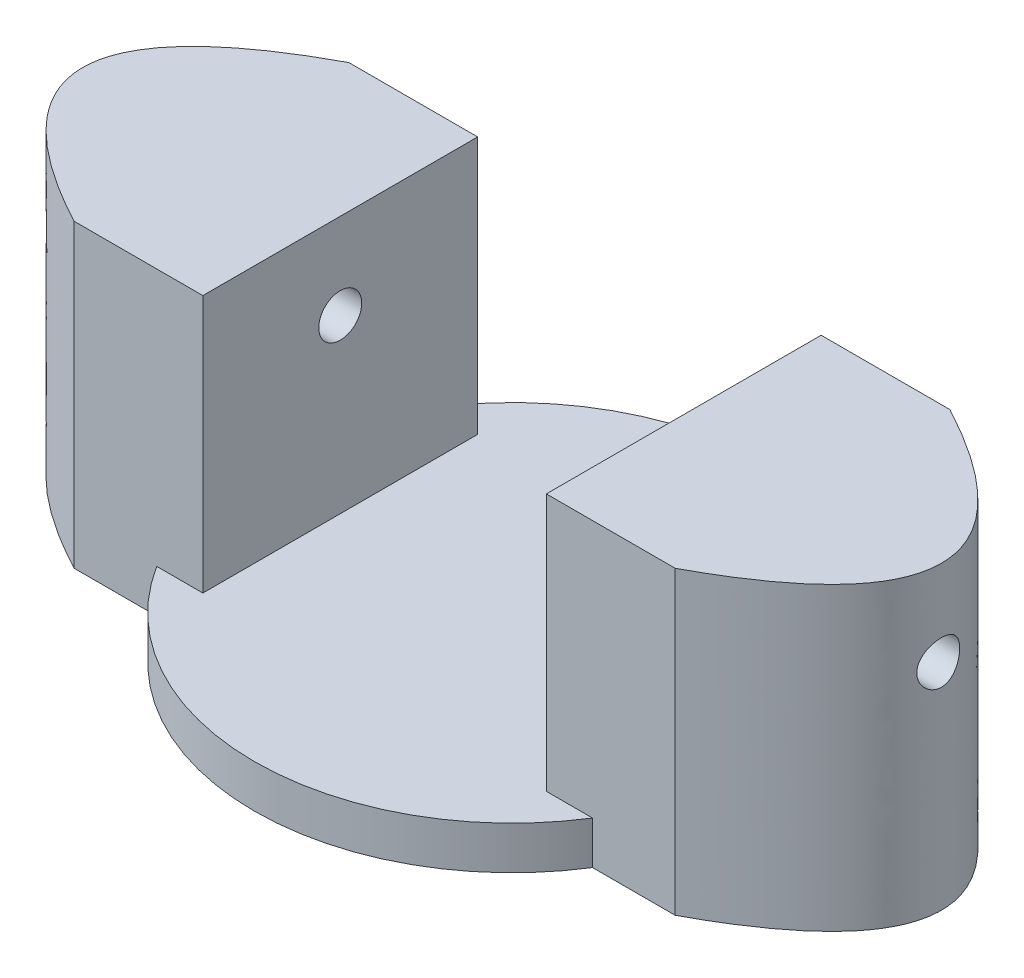
ISO-10303-21;
HEADER;
FILE_DESCRIPTION(('STEP AP214'),'2;1');
FILE_NAME('part.step','',(''),(''),'','','');
FILE_SCHEMA(('AUTOMOTIVE_DESIGN { 1 0 10303 214 1 1 1 1 }'));
ENDSEC;
DATA;
#1=APPLICATION_CONTEXT('core data for automotive mechanical design processes');
#2=APPLICATION_PROTOCOL_DEFINITION('international standard','automotive_design',2000,#1);
#3=PRODUCT_CONTEXT('',#1,'mechanical');
#4=PRODUCT('Part','Part','',(#3));
#5=PRODUCT_RELATED_PRODUCT_CATEGORY('part','',(#4));
#6=PRODUCT_DEFINITION_FORMATION('','',#4);
#7=PRODUCT_DEFINITION_CONTEXT('part definition',#1,'design');
#8=PRODUCT_DEFINITION('design','',#6,#7);
#9=PRODUCT_DEFINITION_SHAPE('','',#8);
#10=(LENGTH_UNIT() NAMED_UNIT(*) SI_UNIT(.MILLI.,.METRE.));
#11=(NAMED_UNIT(*) PLANE_ANGLE_UNIT() SI_UNIT($,.RADIAN.));
#12=(NAMED_UNIT(*) SI_UNIT($,.STERADIAN.) SOLID_ANGLE_UNIT());
#13=UNCERTAINTY_MEASURE_WITH_UNIT(LENGTH_MEASURE(1.E-05),#10,'distance_accuracy_value','');
#14=(GEOMETRIC_REPRESENTATION_CONTEXT(3) GLOBAL_UNCERTAINTY_ASSIGNED_CONTEXT((#13)) GLOBAL_UNIT_ASSIGNED_CONTEXT((#10,
#11,#12)) REPRESENTATION_CONTEXT('',''));
#15=CARTESIAN_POINT('',(0.,0.,0.));
#16=DIRECTION('',(0.,0.,1.));
#17=DIRECTION('',(1.,0.,0.));
#18=AXIS2_PLACEMENT_3D('',#15,#16,#17);
#19=CARTESIAN_POINT('',(0.,30.,-140.));
#20=DIRECTION('',(0.,0.,-1.));
#21=DIRECTION('',(-1.,0.,0.));
#22=AXIS2_PLACEMENT_3D('',#19,#20,#21);
#23=CYLINDRICAL_SURFACE('',#22,5.00000000000002);
#24=CARTESIAN_POINT('',(0.,30.,-140.));
#25=DIRECTION('',(0.,0.,-1.));
#26=DIRECTION('',(-1.,0.,0.));
#27=AXIS2_PLACEMENT_3D('',#24,#25,#26);
#28=CIRCLE('',#27,5.00000000000002);
#29=CARTESIAN_POINT('',(-5.00000000000005,30.,-140.));
#30=VERTEX_POINT('',#29);
#31=EDGE_CURVE('E12',#30,#30,#28,.T.);
#32=ORIENTED_EDGE('',*,*,#31,.T.);
#33=EDGE_LOOP('',(#32));
#34=FACE_BOUND('',#33,.T.);
#35=CARTESIAN_POINT('',(0.,30.,-160.));
#36=DIRECTION('',(0.,0.,-1.));
#37=DIRECTION('',(-1.,0.,0.));
#38=AXIS2_PLACEMENT_3D('',#35,#36,#37);
#39=CIRCLE('',#38,5.00000000000002);
#40=CARTESIAN_POINT('',(-5.00000000000005,30.,-160.));
#41=VERTEX_POINT('',#40);
#42=EDGE_CURVE('E77',#41,#41,#39,.T.);
#43=ORIENTED_EDGE('',*,*,#42,.F.);
#44=EDGE_LOOP('',(#43));
#45=FACE_BOUND('',#44,.T.);
#46=ADVANCED_FACE('F71',(#34,#45),#23,.T.);
#47=CARTESIAN_POINT('',(0.,30.,-140.));
#48=DIRECTION('',(0.,0.,-1.));
#49=DIRECTION('',(-1.,0.,0.));
#50=AXIS2_PLACEMENT_3D('',#47,#48,#49);
#51=PLANE('',#50);
#52=ORIENTED_EDGE('',*,*,#31,.F.);
#53=EDGE_LOOP('',(#52));
#54=FACE_BOUND('',#53,.T.);
#55=ADVANCED_FACE('F86',(#54),#51,.F.);
#56=CARTESIAN_POINT('',(0.,30.,-160.));
#57=DIRECTION('',(0.,0.,-1.));
#58=DIRECTION('',(-1.,0.,0.));
#59=AXIS2_PLACEMENT_3D('',#56,#57,#58);
#60=PLANE('',#59);
#61=ORIENTED_EDGE('',*,*,#42,.T.);
#62=EDGE_LOOP('',(#61));
#63=FACE_BOUND('',#62,.T.);
#64=ADVANCED_FACE('F83',(#63),#60,.T.);
#65=CLOSED_SHELL('',(#46,#55,#64));
#66=MANIFOLD_SOLID_BREP('B2',#65);
#67=CARTESIAN_POINT('',(0.,0.,0.));
#68=DIRECTION('',(0.,1.,0.));
#69=DIRECTION('',(0.,0.,1.));
#70=AXIS2_PLACEMENT_3D('',#67,#68,#69);
#71=PLANE('',#70);
#72=CARTESIAN_POINT('',(0.,0.,0.));
#73=DIRECTION('',(0.,1.,0.));
#74=DIRECTION('',(0.,0.,1.));
#75=AXIS2_PLACEMENT_3D('',#72,#73,#74);
#76=CIRCLE('',#75,25.);
#77=CARTESIAN_POINT('',(0.,0.,25.));
#78=VERTEX_POINT('',#77);
#79=EDGE_CURVE('E279',#78,#78,#76,.T.);
#80=ORIENTED_EDGE('',*,*,#79,.T.);
#81=EDGE_LOOP('',(#80));
#82=FACE_BOUND('',#81,.T.);
#83=CARTESIAN_POINT('',(-175.,0.,-80.));
#84=CARTESIAN_POINT('',(-325.,0.,0.));
#85=CARTESIAN_POINT('',(-175.,0.,80.));
#86=B_SPLINE_CURVE_WITH_KNOTS('',2,(#83,#84,#85),.UNSPECIFIED.,.F.,.F.,(3,3),(0.,1.),.UNSPECIFIED.);
#87=CARTESIAN_POINT('',(-175.,0.,-80.));
#88=VERTEX_POINT('',#87);
#89=CARTESIAN_POINT('',(-175.,0.,80.));
#90=VERTEX_POINT('',#89);
#91=EDGE_CURVE('E294',#88,#90,#86,.T.);
#92=ORIENTED_EDGE('',*,*,#91,.F.);
#93=DIRECTION('',(1.,0.,0.));
#94=VECTOR('',#93,1.);
#95=CARTESIAN_POINT('',(-250.,0.,-80.));
#96=LINE('',#95,#94);
#97=CARTESIAN_POINT('',(-126.885775404495,0.,-80.));
#98=VERTEX_POINT('',#97);
#99=EDGE_CURVE('E215',#88,#98,#96,.T.);
#100=ORIENTED_EDGE('',*,*,#99,.T.);
#101=CARTESIAN_POINT('',(0.,0.,0.));
#102=DIRECTION('',(0.,1.,0.));
#103=DIRECTION('',(0.,0.,1.));
#104=AXIS2_PLACEMENT_3D('',#101,#102,#103);
#105=CIRCLE('',#104,150.);
#106=CARTESIAN_POINT('',(126.885775404495,0.,-80.));
#107=VERTEX_POINT('',#106);
#108=EDGE_CURVE('E281',#107,#98,#105,.T.);
#109=ORIENTED_EDGE('',*,*,#108,.F.);
#110=DIRECTION('',(1.,0.,0.));
#111=VECTOR('',#110,1.);
#112=CARTESIAN_POINT('',(250.,0.,-80.));
#113=LINE('',#112,#111);
#114=CARTESIAN_POINT('',(175.,0.,-80.));
#115=VERTEX_POINT('',#114);
#116=EDGE_CURVE('E255',#107,#115,#113,.T.);
#117=ORIENTED_EDGE('',*,*,#116,.T.);
#118=CARTESIAN_POINT('',(175.,0.,-80.));
#119=CARTESIAN_POINT('',(325.,0.,0.));
#120=CARTESIAN_POINT('',(175.,0.,80.));
#121=B_SPLINE_CURVE_WITH_KNOTS('',2,(#118,#119,#120),.UNSPECIFIED.,.F.,.F.,(3,3),(0.,1.),.UNSPECIFIED.);
#122=CARTESIAN_POINT('',(175.,0.,80.));
#123=VERTEX_POINT('',#122);
#124=EDGE_CURVE('E331',#115,#123,#121,.T.);
#125=ORIENTED_EDGE('',*,*,#124,.T.);
#126=DIRECTION('',(-1.,0.,0.));
#127=VECTOR('',#126,1.);
#128=CARTESIAN_POINT('',(250.,0.,80.));
#129=LINE('',#128,#127);
#130=CARTESIAN_POINT('',(126.885775404495,0.,80.));
#131=VERTEX_POINT('',#130);
#132=EDGE_CURVE('E253',#123,#131,#129,.T.);
#133=ORIENTED_EDGE('',*,*,#132,.T.);
#134=CARTESIAN_POINT('',(-126.885775404495,0.,80.));
#135=VERTEX_POINT('',#134);
#136=EDGE_CURVE('E276',#135,#131,#105,.T.);
#137=ORIENTED_EDGE('',*,*,#136,.F.);
#138=DIRECTION('',(-1.,0.,0.));
#139=VECTOR('',#138,1.);
#140=CARTESIAN_POINT('',(-250.,0.,80.));
#141=LINE('',#140,#139);
#142=EDGE_CURVE('E230',#135,#90,#141,.T.);
#143=ORIENTED_EDGE('',*,*,#142,.T.);
#144=EDGE_LOOP('',(#92,#100,#109,#117,#125,#133,#137,#143));
#145=FACE_BOUND('',#144,.T.);
#146=ADVANCED_FACE('F112',(#82,#145),#71,.F.);
#147=CARTESIAN_POINT('',(0.,175.,0.));
#148=DIRECTION('',(0.,1.,0.));
#149=DIRECTION('',(0.,0.,1.));
#150=AXIS2_PLACEMENT_3D('',#147,#148,#149);
#151=PLANE('',#150);
#152=DIRECTION('',(-1.,0.,0.));
#153=VECTOR('',#152,1.);
#154=CARTESIAN_POINT('',(-250.,175.,-80.));
#155=LINE('',#154,#153);
#156=CARTESIAN_POINT('',(-99.9999999999999,175.,-80.));
#157=VERTEX_POINT('',#156);
#158=CARTESIAN_POINT('',(-175.,175.,-80.));
#159=VERTEX_POINT('',#158);
#160=EDGE_CURVE('E213',#157,#159,#155,.T.);
#161=ORIENTED_EDGE('',*,*,#160,.T.);
#162=CARTESIAN_POINT('',(-175.,175.,-80.));
#163=CARTESIAN_POINT('',(-325.,175.,0.));
#164=CARTESIAN_POINT('',(-175.,175.,80.));
#165=B_SPLINE_CURVE_WITH_KNOTS('',2,(#162,#163,#164),.UNSPECIFIED.,.F.,.F.,(3,3),(0.,1.),.UNSPECIFIED.);
#166=CARTESIAN_POINT('',(-175.,175.,80.));
#167=VERTEX_POINT('',#166);
#168=EDGE_CURVE('E199',#159,#167,#165,.T.);
#169=ORIENTED_EDGE('',*,*,#168,.T.);
#170=DIRECTION('',(1.,0.,0.));
#171=VECTOR('',#170,1.);
#172=CARTESIAN_POINT('',(-250.,175.,80.));
#173=LINE('',#172,#171);
#174=CARTESIAN_POINT('',(-100.,175.,80.));
#175=VERTEX_POINT('',#174);
#176=EDGE_CURVE('E225',#167,#175,#173,.T.);
#177=ORIENTED_EDGE('',*,*,#176,.T.);
#178=DIRECTION('',(0.,0.,-1.));
#179=VECTOR('',#178,1.);
#180=CARTESIAN_POINT('',(-100.,175.,80.));
#181=LINE('',#180,#179);
#182=EDGE_CURVE('E219',#175,#157,#181,.T.);
#183=ORIENTED_EDGE('',*,*,#182,.T.);
#184=EDGE_LOOP('',(#161,#169,#177,#183));
#185=FACE_BOUND('',#184,.T.);
#186=ADVANCED_FACE('F217',(#185),#151,.T.);
#187=CARTESIAN_POINT('',(-250.,125.,-2.10717200501364E-13));
#188=DIRECTION('',(1.,0.,0.));
#189=DIRECTION('',(0.,0.,-1.));
#190=AXIS2_PLACEMENT_3D('',#187,#188,#189);
#191=CYLINDRICAL_SURFACE('',#190,12.5);
#192=CARTESIAN_POINT('',(-100.,125.,0.));
#193=DIRECTION('',(1.,0.,0.));
#194=DIRECTION('',(0.,0.,-1.));
#195=AXIS2_PLACEMENT_3D('',#192,#193,#194);
#196=CIRCLE('',#195,12.5);
#197=CARTESIAN_POINT('',(-100.,125.,-12.5000000000001));
#198=VERTEX_POINT('',#197);
#199=EDGE_CURVE('E290',#198,#198,#196,.T.);
#200=ORIENTED_EDGE('',*,*,#199,.T.);
#201=EDGE_LOOP('',(#200));
#202=FACE_BOUND('',#201,.T.);
#203=CARTESIAN_POINT('',(-250.,137.5,6.59368393218784E-11));
#204=CARTESIAN_POINT('',(-249.999999346807,137.499999093875,0.343102084910564));
#205=CARTESIAN_POINT('',(-249.99585080345,137.485861748762,0.686223987417913));
#206=CARTESIAN_POINT('',(-249.979373640071,137.429427500027,1.37007406495184));
#207=CARTESIAN_POINT('',(-249.967041681019,137.387119101915,1.71080120548476));
#208=CARTESIAN_POINT('',(-249.934528830357,137.274619832521,2.38781234488959));
#209=CARTESIAN_POINT('',(-249.914335150058,137.204383526816,2.72408817646072));
#210=CARTESIAN_POINT('',(-249.866686475128,137.036649675183,3.38920138805786));
#211=CARTESIAN_POINT('',(-249.839232199246,136.939154827605,3.71803950087016));
#212=CARTESIAN_POINT('',(-249.777904896114,136.717938492816,4.365396408169));
#213=CARTESIAN_POINT('',(-249.744045003467,136.594270612394,4.68393478393176));
#214=CARTESIAN_POINT('',(-249.670810071922,136.321559422729,5.30929961748445));
#215=CARTESIAN_POINT('',(-249.631434906872,136.172515533032,5.61612580717173));
#216=CARTESIAN_POINT('',(-249.548258602354,135.850223297306,6.2159904206251));
#217=CARTESIAN_POINT('',(-249.504459292824,135.676984947462,6.5090344721173));
#218=CARTESIAN_POINT('',(-249.413573943264,135.307398268447,7.07977199005692));
#219=CARTESIAN_POINT('',(-249.366486734235,135.111041702483,7.3574599331701));
#220=CARTESIAN_POINT('',(-249.269076031287,134.691384194242,7.90242211914029));
#221=CARTESIAN_POINT('',(-249.21870110922,134.467533323812,8.16926382250951));
#222=CARTESIAN_POINT('',(-249.117189644228,133.998435968708,8.68327242838803));
#223=CARTESIAN_POINT('',(-249.066053089823,133.753189161283,8.93043903399651));
#224=CARTESIAN_POINT('',(-248.964392814078,133.242774112269,9.40360668477044));
#225=CARTESIAN_POINT('',(-248.913869320556,132.977598713439,9.62960005958933));
#226=CARTESIAN_POINT('',(-248.81485277516,132.429171584493,10.0587576423846));
#227=CARTESIAN_POINT('',(-248.766359023023,132.145926175126,10.2619297651479));
#228=CARTESIAN_POINT('',(-248.671795075195,131.557297229458,10.6479175668651));
#229=CARTESIAN_POINT('',(-248.625791707153,131.25158683047,10.8302516500298));
#230=CARTESIAN_POINT('',(-248.53860860211,130.62518262836,11.1684380205336));
#231=CARTESIAN_POINT('',(-248.497428945701,130.304488575024,11.3242898654437));
#232=CARTESIAN_POINT('',(-248.421124155886,129.650396122786,11.6082257108812));
#233=CARTESIAN_POINT('',(-248.385998006781,129.316999866634,11.7363143706458));
#234=CARTESIAN_POINT('',(-248.322859179983,128.639860477579,11.9636513142108));
#235=CARTESIAN_POINT('',(-248.294846276832,128.296117673001,12.06290051211));
#236=CARTESIAN_POINT('',(-248.247427346862,127.60993407839,12.2294571261765));
#237=CARTESIAN_POINT('',(-248.227815833081,127.267693304177,12.2975303517024));
#238=CARTESIAN_POINT('',(-248.19674715385,126.578354420217,12.4048565147915));
#239=CARTESIAN_POINT('',(-248.185289859428,126.231256387383,12.4441099081835));
#240=CARTESIAN_POINT('',(-248.170877511679,125.534878188346,12.4934274334157));
#241=CARTESIAN_POINT('',(-248.167920951844,125.185598419788,12.5034967372903));
#242=CARTESIAN_POINT('',(-248.170595993749,124.487458100767,12.4943653305232));
#243=CARTESIAN_POINT('',(-248.176227441452,124.138597542896,12.4751651448692));
#244=CARTESIAN_POINT('',(-248.195601574975,123.454689812635,12.4087222099399));
#245=CARTESIAN_POINT('',(-248.209088203206,123.119548941904,12.3623644582618));
#246=CARTESIAN_POINT('',(-248.243581515575,122.454508747715,12.2427373433014));
#247=CARTESIAN_POINT('',(-248.264588019879,122.124609299106,12.1694686235857));
#248=CARTESIAN_POINT('',(-248.313535341379,121.472288302598,11.9966291101765));
#249=CARTESIAN_POINT('',(-248.341476535127,121.149867161808,11.8970568881916));
#250=CARTESIAN_POINT('',(-248.403525176571,120.514648921365,11.6724086948999));
#251=CARTESIAN_POINT('',(-248.437632741013,120.201852004055,11.547332240725));
#252=CARTESIAN_POINT('',(-248.511529927186,119.584246905871,11.2709989947924));
#253=CARTESIAN_POINT('',(-248.5513819746,119.27957694503,11.1194500879753));
#254=CARTESIAN_POINT('',(-248.635381223079,118.684050993487,10.7923218074596));
#255=CARTESIAN_POINT('',(-248.679528442697,118.393195062461,10.6167423299641));
#256=CARTESIAN_POINT('',(-248.770942673286,117.827095078748,10.2427781872558));
#257=CARTESIAN_POINT('',(-248.818209401153,117.551849613574,10.0443955902774));
#258=CARTESIAN_POINT('',(-248.914652229052,117.018469521872,9.62601234770884));
#259=CARTESIAN_POINT('',(-248.963829188655,116.760342743275,9.4060019001639));
#260=CARTESIAN_POINT('',(-249.064608208854,116.253778833654,8.93739165223845));
#261=CARTESIAN_POINT('',(-249.116233225323,116.006040348185,8.68804097389517));
#262=CARTESIAN_POINT('',(-249.218690823966,115.532458148997,8.16938950286317));
#263=CARTESIAN_POINT('',(-249.269523717224,115.306605648528,7.90009679371777));
#264=CARTESIAN_POINT('',(-249.369037904199,114.878050546846,7.34300492329623));
#265=CARTESIAN_POINT('',(-249.417717717412,114.67536372767,7.05519335190481));
#266=CARTESIAN_POINT('',(-249.511516195468,114.294754648081,6.46309348002535));
#267=CARTESIAN_POINT('',(-249.556634971771,114.116831612421,6.15880569575005));
#268=CARTESIAN_POINT('',(-249.642351703571,113.785799137283,5.53334036635334));
#269=CARTESIAN_POINT('',(-249.682912059568,113.632891914238,5.21205054454521));
#270=CARTESIAN_POINT('',(-249.757902093828,113.354815381504,4.55700184013363));
#271=CARTESIAN_POINT('',(-249.79233206912,113.229644727858,4.22324356259691));
#272=CARTESIAN_POINT('',(-249.853965258085,113.008311087153,3.54626456578631));
#273=CARTESIAN_POINT('',(-249.881181448294,112.912095970537,3.20306208031795));
#274=CARTESIAN_POINT('',(-249.927619626672,112.749278004715,2.50931774572043));
#275=CARTESIAN_POINT('',(-249.946845307887,112.682661474676,2.15877936594865));
#276=CARTESIAN_POINT('',(-249.974426270505,112.587523366829,1.50717629539123));
#277=CARTESIAN_POINT('',(-249.983997425697,112.554722898391,1.20678000112669));
#278=CARTESIAN_POINT('',(-249.996784590355,112.510960773713,0.604260931712692));
#279=CARTESIAN_POINT('',(-250.000000575206,112.499999202063,0.3021381498805));
#280=CARTESIAN_POINT('',(-249.999999346808,112.500000906122,-0.343102084778307));
#281=CARTESIAN_POINT('',(-249.995850803452,112.514138251231,-0.686223987285458));
#282=CARTESIAN_POINT('',(-249.979373640075,112.570572499959,-1.37007406481932));
#283=CARTESIAN_POINT('',(-249.967041681025,112.612880898066,-1.71080120535238));
#284=CARTESIAN_POINT('',(-249.934528830365,112.725380167454,-2.38781234475788));
#285=CARTESIAN_POINT('',(-249.914335150066,112.795616473155,-2.72408817632954));
#286=CARTESIAN_POINT('',(-249.866686475138,112.96335032478,-3.38920138792804));
#287=CARTESIAN_POINT('',(-249.839232199257,113.060845172355,-3.71803950074117));
#288=CARTESIAN_POINT('',(-249.777904896127,113.282061507136,-4.36539640804199));
#289=CARTESIAN_POINT('',(-249.74404500348,113.405729387555,-4.68393478380588));
#290=CARTESIAN_POINT('',(-249.670810071938,113.678440577213,-5.30929961736114));
#291=CARTESIAN_POINT('',(-249.631434906888,113.827484466907,-5.61612580704984));
#292=CARTESIAN_POINT('',(-249.548258602371,114.149776702626,-6.21599042050631));
#293=CARTESIAN_POINT('',(-249.504459292842,114.323015052466,-6.50903447200019));
#294=CARTESIAN_POINT('',(-249.413573943283,114.692601731475,-7.07977198994345));
#295=CARTESIAN_POINT('',(-249.366486734254,114.888958297435,-7.35745993305859));
#296=CARTESIAN_POINT('',(-249.269076031307,115.30861580567,-7.90242211903288));
#297=CARTESIAN_POINT('',(-249.21870110924,115.532466676097,-8.16926382240427));
#298=CARTESIAN_POINT('',(-249.117189644248,116.001564031194,-8.68327242828743));
#299=CARTESIAN_POINT('',(-249.066053089843,116.246810838617,-8.93043903389838));
#300=CARTESIAN_POINT('',(-248.964392814099,116.757225887624,-9.40360668467747));
#301=CARTESIAN_POINT('',(-248.913869320577,117.022401286451,-9.62960005949906));
#302=CARTESIAN_POINT('',(-248.81485277518,117.570828415392,-10.0587576423));
#303=CARTESIAN_POINT('',(-248.766359023042,117.854073824756,-10.2619297650663));
#304=CARTESIAN_POINT('',(-248.671795075213,118.44270277042,-10.64791756679));
#305=CARTESIAN_POINT('',(-248.625791707171,118.748413169405,-10.8302516499581));
#306=CARTESIAN_POINT('',(-248.538608602127,119.374817371512,-11.1684380204692));
#307=CARTESIAN_POINT('',(-248.497428945717,119.695511424845,-11.324289865383));
#308=CARTESIAN_POINT('',(-248.421124155901,120.34960387708,-11.608225710828));
#309=CARTESIAN_POINT('',(-248.385998006794,120.68300013323,-11.7363143705964));
#310=CARTESIAN_POINT('',(-248.322859179995,121.360139522283,-11.9636513141692));
#311=CARTESIAN_POINT('',(-248.294846276843,121.70388232686,-12.0629005120724));
#312=CARTESIAN_POINT('',(-248.24742734687,122.390065921469,-12.2294571261468));
#313=CARTESIAN_POINT('',(-248.227815833088,122.732306695682,-12.2975303516768));
#314=CARTESIAN_POINT('',(-248.196747153855,123.421645579642,-12.4048565147739));
#315=CARTESIAN_POINT('',(-248.185289859432,123.768743612475,-12.4441099081699));
#316=CARTESIAN_POINT('',(-248.170877511681,124.465121811513,-12.49342743341));
#317=CARTESIAN_POINT('',(-248.167920951844,124.814401580071,-12.5034967372886));
#318=CARTESIAN_POINT('',(-248.170595993747,125.512541899094,-12.4943653305293));
#319=CARTESIAN_POINT('',(-248.176227441449,125.861402456965,-12.4751651448793));
#320=CARTESIAN_POINT('',(-248.19560157497,126.545310187227,-12.4087222099575));
#321=CARTESIAN_POINT('',(-248.209088203199,126.880451057959,-12.362364458283));
#322=CARTESIAN_POINT('',(-248.243581515567,127.54549125215,-12.24273734333));
#323=CARTESIAN_POINT('',(-248.264588019869,127.87539070076,-12.1694686236179));
#324=CARTESIAN_POINT('',(-248.313535341368,128.52771169727,-11.9966291102157));
#325=CARTESIAN_POINT('',(-248.341476535115,128.850132838061,-11.8970568882343));
#326=CARTESIAN_POINT('',(-248.403525176557,129.485351078507,-11.6724086949494));
#327=CARTESIAN_POINT('',(-248.437632740998,129.798147995819,-11.5473322407779));
#328=CARTESIAN_POINT('',(-248.51152992717,130.415753094005,-11.2709989948521));
#329=CARTESIAN_POINT('',(-248.551381974583,130.720423054849,-11.1194500880384));
#330=CARTESIAN_POINT('',(-248.635381223061,131.315949006395,-10.7923218075295));
#331=CARTESIAN_POINT('',(-248.679528442678,131.606804937422,-10.6167423300373));
#332=CARTESIAN_POINT('',(-248.770942673266,132.172904921138,-10.2427781873357));
#333=CARTESIAN_POINT('',(-248.818209401134,132.448150386314,-10.0443955903605));
#334=CARTESIAN_POINT('',(-248.914652229032,132.981530478021,-9.62601234779831));
#335=CARTESIAN_POINT('',(-248.963829188634,133.23965725662,-9.40600190025648));
#336=CARTESIAN_POINT('',(-249.064608208833,133.746221166245,-8.93739165233719));
#337=CARTESIAN_POINT('',(-249.116233225302,133.993959651717,-8.68804097399695));
#338=CARTESIAN_POINT('',(-249.218690823945,134.467541850911,-8.16938950297082));
#339=CARTESIAN_POINT('',(-249.269523717203,134.693394351383,-7.90009679382827));
#340=CARTESIAN_POINT('',(-249.369037904179,135.12194945307,-7.34300492341224));
#341=CARTESIAN_POINT('',(-249.417717717393,135.324636272249,-7.05519335202348));
#342=CARTESIAN_POINT('',(-249.511516195449,135.705245351845,-6.4630934801491));
#343=CARTESIAN_POINT('',(-249.556634971752,135.883168387508,-6.15880569587621));
#344=CARTESIAN_POINT('',(-249.642351703554,136.214200862653,-5.53334036648363));
#345=CARTESIAN_POINT('',(-249.682912059552,136.367108085702,-5.21205054467719));
#346=CARTESIAN_POINT('',(-249.757902093814,136.645184618444,-4.55700184026863));
#347=CARTESIAN_POINT('',(-249.792332069106,136.770355272093,-4.22324356273327));
#348=CARTESIAN_POINT('',(-249.853965258074,136.991688912806,-3.54626456592494));
#349=CARTESIAN_POINT('',(-249.881181448283,137.087904029426,-3.20306208045752));
#350=CARTESIAN_POINT('',(-249.927619626663,137.250721995257,-2.50931774586151));
#351=CARTESIAN_POINT('',(-249.94684530788,137.3173385253,-2.15877936609029));
#352=CARTESIAN_POINT('',(-249.974426270502,137.41247663316,-1.50717629548837));
#353=CARTESIAN_POINT('',(-249.983997425696,137.445277101605,-1.20678000117832));
#354=CARTESIAN_POINT('',(-249.996784590356,137.48903922629,-0.604260931672769));
#355=CARTESIAN_POINT('',(-250.000000575206,137.50000079794,-0.302138149794533));
#356=CARTESIAN_POINT('',(-250.,137.5,6.59368393218784E-11));
#357=B_SPLINE_CURVE_WITH_KNOTS('',3,(#203,#204,#205,#206,#207,#208,#209,#210,#211,#212,#213,
#214,#215,#216,#217,#218,#219,#220,#221,#222,#223,#224,#225,#226,#227,#228,#229,#230,#231,#232,
#233,#234,#235,#236,#237,#238,#239,#240,#241,#242,#243,#244,#245,#246,#247,#248,#249,#250,#251,
#252,#253,#254,#255,#256,#257,#258,#259,#260,#261,#262,#263,#264,#265,#266,#267,#268,#269,#270,
#271,#272,#273,#274,#275,#276,#277,#278,#279,#280,#281,#282,#283,#284,#285,#286,#287,#288,#289,
#290,#291,#292,#293,#294,#295,#296,#297,#298,#299,#300,#301,#302,#303,#304,#305,#306,#307,#308,
#309,#310,#311,#312,#313,#314,#315,#316,#317,#318,#319,#320,#321,#322,#323,#324,#325,#326,#327,
#328,#329,#330,#331,#332,#333,#334,#335,#336,#337,#338,#339,#340,#341,#342,#343,#344,#345,#346,
#347,#348,#349,#350,#351,#352,#353,#354,#355,#356),.UNSPECIFIED.,.T.,.F.,(4,2,2,2,2,2,2,2,2,2,2,
2,2,2,2,2,2,2,2,2,2,2,2,2,2,2,2,2,2,2,2,2,2,2,2,2,2,2,2,2,2,2,2,2,2,2,2,2,2,2,2,2,2,2,2,2,2,2,2,
2,2,2,2,2,2,2,2,2,2,2,2,2,2,2,2,2,4),(0.,1.02902567045117,2.05847146639345,3.08959891004009,
4.12062431746768,5.14955810097172,6.17851542360448,7.20704887295515,8.235949893934,
9.29051589997581,10.3450978165962,11.4000603072561,12.4546557823898,13.530090894836,
14.6055439724205,15.6808164267374,16.7560547953829,17.80323995308,18.8504085476144,
19.8973915504976,20.9443557745509,21.9589634365151,22.9735468360669,23.9881853392562,
25.0028430542366,26.0295000617222,27.056161503861,28.0827299015608,29.1097657141263,
30.1743273394004,31.2384597799038,32.3033129121029,33.3681327008973,34.4411748897558,
35.5141650737061,36.585211802007,37.6557629629813,38.5619268181964,39.4680941832901,
40.4971198537402,41.5265656496814,42.5576930933272,43.5887185007539,44.617652284257,
45.6466096068888,46.6751430562385,47.7040440772164,48.7586100832569,49.8131919998759,
50.8681544905346,51.9227499656669,52.9981850781133,54.073638155698,55.148910610015,
56.2241489786607,57.2713341363593,58.3185027308951,59.3654857337798,60.4124499578345,
61.4270576197991,62.4416410193513,63.4562795225411,64.4709372375219,65.4975942450064,
66.524255687144,67.5508240848428,68.5778598974071,69.6424215226801,70.7065539631825,
71.7714070953805,72.8362268841738,73.909269073033,74.9822592569838,76.0533059852855,
77.1238571462606,78.0300210016134,78.9361883668447),.UNSPECIFIED.);
#358=CARTESIAN_POINT('',(-250.,137.5,6.59368393218784E-11));
#359=VERTEX_POINT('',#358);
#360=EDGE_CURVE('E120',#359,#359,#357,.T.);
#361=ORIENTED_EDGE('',*,*,#360,.F.);
#362=EDGE_LOOP('',(#361));
#363=FACE_BOUND('',#362,.T.);
#364=ADVANCED_FACE('F303',(#202,#363),#191,.F.);
#365=CARTESIAN_POINT('',(-250.,-219.317121994613,-80.));
#366=DIRECTION('',(0.,0.,-1.));
#367=DIRECTION('',(-1.,0.,0.));
#368=AXIS2_PLACEMENT_3D('',#365,#366,#367);
#369=PLANE('',#368);
#370=ORIENTED_EDGE('',*,*,#99,.F.);
#371=DIRECTION('',(0.,1.,0.));
#372=VECTOR('',#371,1.);
#373=CARTESIAN_POINT('',(-175.,-25.,-80.));
#374=LINE('',#373,#372);
#375=EDGE_CURVE('E69',#88,#159,#374,.T.);
#376=ORIENTED_EDGE('',*,*,#375,.T.);
#377=ORIENTED_EDGE('',*,*,#160,.F.);
#378=DIRECTION('',(0.,1.,0.));
#379=VECTOR('',#378,1.);
#380=CARTESIAN_POINT('',(-99.9999999999999,-219.317121994613,-80.));
#381=LINE('',#380,#379);
#382=CARTESIAN_POINT('',(-99.9999999999999,25.,-80.));
#383=VERTEX_POINT('',#382);
#384=EDGE_CURVE('E223',#383,#157,#381,.T.);
#385=ORIENTED_EDGE('',*,*,#384,.F.);
#386=DIRECTION('',(-1.,0.,0.));
#387=VECTOR('',#386,1.);
#388=CARTESIAN_POINT('',(0.,25.,-80.));
#389=LINE('',#388,#387);
#390=CARTESIAN_POINT('',(-126.885775404495,25.,-80.));
#391=VERTEX_POINT('',#390);
#392=EDGE_CURVE('E235',#383,#391,#389,.T.);
#393=ORIENTED_EDGE('',*,*,#392,.T.);
#394=DIRECTION('',(0.,-1.,0.));
#395=VECTOR('',#394,1.);
#396=CARTESIAN_POINT('',(-126.885775404495,25.,-80.));
#397=LINE('',#396,#395);
#398=EDGE_CURVE('E238',#98,#391,#397,.F.);
#399=ORIENTED_EDGE('',*,*,#398,.F.);
#400=EDGE_LOOP('',(#370,#376,#377,#385,#393,#399));
#401=FACE_BOUND('',#400,.T.);
#402=ADVANCED_FACE('F211',(#401),#369,.T.);
#403=CARTESIAN_POINT('',(-250.,-219.317121994613,80.));
#404=DIRECTION('',(0.,0.,1.));
#405=DIRECTION('',(1.,0.,0.));
#406=AXIS2_PLACEMENT_3D('',#403,#404,#405);
#407=PLANE('',#406);
#408=ORIENTED_EDGE('',*,*,#176,.F.);
#409=DIRECTION('',(0.,1.,0.));
#410=VECTOR('',#409,1.);
#411=CARTESIAN_POINT('',(-175.,-25.,80.));
#412=LINE('',#411,#410);
#413=EDGE_CURVE('E203',#90,#167,#412,.T.);
#414=ORIENTED_EDGE('',*,*,#413,.F.);
#415=ORIENTED_EDGE('',*,*,#142,.F.);
#416=DIRECTION('',(0.,-1.,0.));
#417=VECTOR('',#416,1.);
#418=CARTESIAN_POINT('',(-126.885775404495,25.,80.));
#419=LINE('',#418,#417);
#420=CARTESIAN_POINT('',(-126.885775404495,25.,80.));
#421=VERTEX_POINT('',#420);
#422=EDGE_CURVE('E242',#421,#135,#419,.T.);
#423=ORIENTED_EDGE('',*,*,#422,.F.);
#424=DIRECTION('',(1.,0.,0.));
#425=VECTOR('',#424,1.);
#426=CARTESIAN_POINT('',(0.,25.,80.));
#427=LINE('',#426,#425);
#428=CARTESIAN_POINT('',(-100.,25.,80.));
#429=VERTEX_POINT('',#428);
#430=EDGE_CURVE('E131',#421,#429,#427,.T.);
#431=ORIENTED_EDGE('',*,*,#430,.T.);
#432=DIRECTION('',(0.,1.,0.));
#433=VECTOR('',#432,1.);
#434=CARTESIAN_POINT('',(-100.,-219.317121994613,80.));
#435=LINE('',#434,#433);
#436=EDGE_CURVE('E220',#429,#175,#435,.T.);
#437=ORIENTED_EDGE('',*,*,#436,.T.);
#438=EDGE_LOOP('',(#408,#414,#415,#423,#431,#437));
#439=FACE_BOUND('',#438,.T.);
#440=ADVANCED_FACE('F347',(#439),#407,.T.);
#441=CARTESIAN_POINT('',(0.,25.,0.));
#442=DIRECTION('',(0.,-1.,0.));
#443=DIRECTION('',(0.,0.,-1.));
#444=AXIS2_PLACEMENT_3D('',#441,#442,#443);
#445=CYLINDRICAL_SURFACE('',#444,150.);
#446=CARTESIAN_POINT('',(0.,25.,0.));
#447=DIRECTION('',(0.,1.,0.));
#448=DIRECTION('',(0.,0.,1.));
#449=AXIS2_PLACEMENT_3D('',#446,#447,#448);
#450=CIRCLE('',#449,150.);
#451=CARTESIAN_POINT('',(126.885775404495,25.,80.));
#452=VERTEX_POINT('',#451);
#453=EDGE_CURVE('E280',#421,#452,#450,.T.);
#454=ORIENTED_EDGE('',*,*,#453,.F.);
#455=ORIENTED_EDGE('',*,*,#422,.T.);
#456=ORIENTED_EDGE('',*,*,#136,.T.);
#457=DIRECTION('',(0.,-1.,0.));
#458=VECTOR('',#457,1.);
#459=CARTESIAN_POINT('',(126.885775404495,25.,80.));
#460=LINE('',#459,#458);
#461=EDGE_CURVE('E273',#131,#452,#460,.F.);
#462=ORIENTED_EDGE('',*,*,#461,.T.);
#463=EDGE_LOOP('',(#454,#455,#456,#462));
#464=FACE_BOUND('',#463,.T.);
#465=ADVANCED_FACE('F392',(#464),#445,.T.);
#466=CARTESIAN_POINT('',(0.,-25.,0.));
#467=DIRECTION('',(0.,1.,0.));
#468=DIRECTION('',(0.,0.,1.));
#469=AXIS2_PLACEMENT_3D('',#466,#467,#468);
#470=CYLINDRICAL_SURFACE('',#469,25.);
#471=CARTESIAN_POINT('',(0.,-25.,0.));
#472=DIRECTION('',(0.,1.,0.));
#473=DIRECTION('',(0.,0.,1.));
#474=AXIS2_PLACEMENT_3D('',#471,#472,#473);
#475=CIRCLE('',#474,25.);
#476=CARTESIAN_POINT('',(0.,-25.,25.));
#477=VERTEX_POINT('',#476);
#478=EDGE_CURVE('E284',#477,#477,#475,.T.);
#479=ORIENTED_EDGE('',*,*,#478,.T.);
#480=EDGE_LOOP('',(#479));
#481=FACE_BOUND('',#480,.T.);
#482=ORIENTED_EDGE('',*,*,#79,.F.);
#483=EDGE_LOOP('',(#482));
#484=FACE_BOUND('',#483,.T.);
#485=ADVANCED_FACE('F114',(#481,#484),#470,.T.);
#486=CARTESIAN_POINT('',(0.,-25.,0.));
#487=DIRECTION('',(0.,1.,0.));
#488=DIRECTION('',(0.,0.,1.));
#489=AXIS2_PLACEMENT_3D('',#486,#487,#488);
#490=PLANE('',#489);
#491=ORIENTED_EDGE('',*,*,#478,.F.);
#492=EDGE_LOOP('',(#491));
#493=FACE_BOUND('',#492,.T.);
#494=ADVANCED_FACE('F419',(#493),#490,.F.);
#495=ORIENTED_EDGE('',*,*,#108,.T.);
#496=ORIENTED_EDGE('',*,*,#398,.T.);
#497=CARTESIAN_POINT('',(126.885775404495,25.,-80.));
#498=VERTEX_POINT('',#497);
#499=EDGE_CURVE('E277',#498,#391,#450,.T.);
#500=ORIENTED_EDGE('',*,*,#499,.F.);
#501=DIRECTION('',(0.,-1.,0.));
#502=VECTOR('',#501,1.);
#503=CARTESIAN_POINT('',(126.885775404495,25.,-80.));
#504=LINE('',#503,#502);
#505=EDGE_CURVE('E265',#498,#107,#504,.T.);
#506=ORIENTED_EDGE('',*,*,#505,.T.);
#507=EDGE_LOOP('',(#495,#496,#500,#506));
#508=FACE_BOUND('',#507,.T.);
#509=ADVANCED_FACE('F355',(#508),#445,.T.);
#510=CARTESIAN_POINT('',(0.,25.,0.));
#511=DIRECTION('',(0.,1.,0.));
#512=DIRECTION('',(0.,0.,1.));
#513=AXIS2_PLACEMENT_3D('',#510,#511,#512);
#514=PLANE('',#513);
#515=ORIENTED_EDGE('',*,*,#499,.T.);
#516=ORIENTED_EDGE('',*,*,#392,.F.);
#517=DIRECTION('',(0.,0.,-1.));
#518=VECTOR('',#517,1.);
#519=CARTESIAN_POINT('',(-100.,25.,0.));
#520=LINE('',#519,#518);
#521=EDGE_CURVE('E127',#429,#383,#520,.T.);
#522=ORIENTED_EDGE('',*,*,#521,.F.);
#523=ORIENTED_EDGE('',*,*,#430,.F.);
#524=ORIENTED_EDGE('',*,*,#453,.T.);
#525=DIRECTION('',(1.,0.,0.));
#526=VECTOR('',#525,1.);
#527=CARTESIAN_POINT('',(0.,25.,80.));
#528=LINE('',#527,#526);
#529=CARTESIAN_POINT('',(100.,25.,80.));
#530=VERTEX_POINT('',#529);
#531=EDGE_CURVE('E270',#530,#452,#528,.T.);
#532=ORIENTED_EDGE('',*,*,#531,.F.);
#533=DIRECTION('',(0.,0.,1.));
#534=VECTOR('',#533,1.);
#535=CARTESIAN_POINT('',(100.,25.,0.));
#536=LINE('',#535,#534);
#537=CARTESIAN_POINT('',(100.,25.,-80.));
#538=VERTEX_POINT('',#537);
#539=EDGE_CURVE('E267',#538,#530,#536,.T.);
#540=ORIENTED_EDGE('',*,*,#539,.F.);
#541=DIRECTION('',(-1.,0.,0.));
#542=VECTOR('',#541,1.);
#543=CARTESIAN_POINT('',(0.,25.,-80.));
#544=LINE('',#543,#542);
#545=EDGE_CURVE('E262',#498,#538,#544,.T.);
#546=ORIENTED_EDGE('',*,*,#545,.F.);
#547=EDGE_LOOP('',(#515,#516,#522,#523,#524,#532,#540,#546));
#548=FACE_BOUND('',#547,.T.);
#549=ADVANCED_FACE('F351',(#548),#514,.T.);
#550=CARTESIAN_POINT('',(250.,-219.317121994613,80.));
#551=DIRECTION('',(0.,0.,1.));
#552=DIRECTION('',(1.,0.,0.));
#553=AXIS2_PLACEMENT_3D('',#550,#551,#552);
#554=PLANE('',#553);
#555=DIRECTION('',(0.,1.,0.));
#556=VECTOR('',#555,1.);
#557=CARTESIAN_POINT('',(175.,-25.,80.));
#558=LINE('',#557,#556);
#559=CARTESIAN_POINT('',(175.,175.,80.));
#560=VERTEX_POINT('',#559);
#561=EDGE_CURVE('E326',#123,#560,#558,.T.);
#562=ORIENTED_EDGE('',*,*,#561,.T.);
#563=DIRECTION('',(1.,0.,0.));
#564=VECTOR('',#563,1.);
#565=CARTESIAN_POINT('',(250.,175.,80.));
#566=LINE('',#565,#564);
#567=CARTESIAN_POINT('',(100.,175.,80.));
#568=VERTEX_POINT('',#567);
#569=EDGE_CURVE('E249',#568,#560,#566,.T.);
#570=ORIENTED_EDGE('',*,*,#569,.F.);
#571=DIRECTION('',(0.,1.,0.));
#572=VECTOR('',#571,1.);
#573=CARTESIAN_POINT('',(100.,-219.317121994613,80.));
#574=LINE('',#573,#572);
#575=EDGE_CURVE('E256',#530,#568,#574,.T.);
#576=ORIENTED_EDGE('',*,*,#575,.F.);
#577=ORIENTED_EDGE('',*,*,#531,.T.);
#578=ORIENTED_EDGE('',*,*,#461,.F.);
#579=ORIENTED_EDGE('',*,*,#132,.F.);
#580=EDGE_LOOP('',(#562,#570,#576,#577,#578,#579));
#581=FACE_BOUND('',#580,.T.);
#582=ADVANCED_FACE('F373',(#581),#554,.T.);
#583=CARTESIAN_POINT('',(250.,-219.317121994613,-80.));
#584=DIRECTION('',(0.,0.,-1.));
#585=DIRECTION('',(-1.,0.,0.));
#586=AXIS2_PLACEMENT_3D('',#583,#584,#585);
#587=PLANE('',#586);
#588=DIRECTION('',(0.,1.,0.));
#589=VECTOR('',#588,1.);
#590=CARTESIAN_POINT('',(175.,-25.,-80.));
#591=LINE('',#590,#589);
#592=CARTESIAN_POINT('',(175.,175.,-80.));
#593=VERTEX_POINT('',#592);
#594=EDGE_CURVE('E207',#115,#593,#591,.T.);
#595=ORIENTED_EDGE('',*,*,#594,.F.);
#596=ORIENTED_EDGE('',*,*,#116,.F.);
#597=ORIENTED_EDGE('',*,*,#505,.F.);
#598=ORIENTED_EDGE('',*,*,#545,.T.);
#599=DIRECTION('',(0.,1.,0.));
#600=VECTOR('',#599,1.);
#601=CARTESIAN_POINT('',(100.,-219.317121994613,-80.));
#602=LINE('',#601,#600);
#603=CARTESIAN_POINT('',(100.,175.,-80.));
#604=VERTEX_POINT('',#603);
#605=EDGE_CURVE('E252',#538,#604,#602,.T.);
#606=ORIENTED_EDGE('',*,*,#605,.T.);
#607=DIRECTION('',(-1.,0.,0.));
#608=VECTOR('',#607,1.);
#609=CARTESIAN_POINT('',(250.,175.,-80.));
#610=LINE('',#609,#608);
#611=EDGE_CURVE('E244',#593,#604,#610,.T.);
#612=ORIENTED_EDGE('',*,*,#611,.F.);
#613=EDGE_LOOP('',(#595,#596,#597,#598,#606,#612));
#614=FACE_BOUND('',#613,.T.);
#615=ADVANCED_FACE('F361',(#614),#587,.T.);
#616=CARTESIAN_POINT('',(100.,-219.317121994613,80.));
#617=DIRECTION('',(-1.,0.,0.));
#618=DIRECTION('',(0.,0.,1.));
#619=AXIS2_PLACEMENT_3D('',#616,#617,#618);
#620=PLANE('',#619);
#621=CARTESIAN_POINT('',(100.,125.,0.));
#622=DIRECTION('',(-1.,0.,0.));
#623=DIRECTION('',(0.,0.,1.));
#624=AXIS2_PLACEMENT_3D('',#621,#622,#623);
#625=CIRCLE('',#624,12.5);
#626=CARTESIAN_POINT('',(100.,125.,12.5000000000001));
#627=VERTEX_POINT('',#626);
#628=EDGE_CURVE('E293',#627,#627,#625,.T.);
#629=ORIENTED_EDGE('',*,*,#628,.F.);
#630=EDGE_LOOP('',(#629));
#631=FACE_BOUND('',#630,.T.);
#632=ORIENTED_EDGE('',*,*,#605,.F.);
#633=ORIENTED_EDGE('',*,*,#539,.T.);
#634=ORIENTED_EDGE('',*,*,#575,.T.);
#635=DIRECTION('',(0.,0.,1.));
#636=VECTOR('',#635,1.);
#637=CARTESIAN_POINT('',(100.,175.,80.));
#638=LINE('',#637,#636);
#639=EDGE_CURVE('E246',#604,#568,#638,.T.);
#640=ORIENTED_EDGE('',*,*,#639,.F.);
#641=EDGE_LOOP('',(#632,#633,#634,#640));
#642=FACE_BOUND('',#641,.T.);
#643=ADVANCED_FACE('F395',(#631,#642),#620,.T.);
#644=CARTESIAN_POINT('',(0.,175.,0.));
#645=DIRECTION('',(0.,1.,0.));
#646=DIRECTION('',(0.,0.,1.));
#647=AXIS2_PLACEMENT_3D('',#644,#645,#646);
#648=PLANE('',#647);
#649=ORIENTED_EDGE('',*,*,#569,.T.);
#650=CARTESIAN_POINT('',(175.,175.,-80.));
#651=CARTESIAN_POINT('',(325.,175.,0.));
#652=CARTESIAN_POINT('',(175.,175.,80.));
#653=B_SPLINE_CURVE_WITH_KNOTS('',2,(#650,#651,#652),.UNSPECIFIED.,.F.,.F.,(3,3),(0.,1.),.UNSPECIFIED.);
#654=EDGE_CURVE('E319',#593,#560,#653,.T.);
#655=ORIENTED_EDGE('',*,*,#654,.F.);
#656=ORIENTED_EDGE('',*,*,#611,.T.);
#657=ORIENTED_EDGE('',*,*,#639,.T.);
#658=EDGE_LOOP('',(#649,#655,#656,#657));
#659=FACE_BOUND('',#658,.T.);
#660=ADVANCED_FACE('F368',(#659),#648,.T.);
#661=CARTESIAN_POINT('',(-100.,-219.317121994613,80.));
#662=DIRECTION('',(1.,0.,0.));
#663=DIRECTION('',(0.,0.,-1.));
#664=AXIS2_PLACEMENT_3D('',#661,#662,#663);
#665=PLANE('',#664);
#666=ORIENTED_EDGE('',*,*,#199,.F.);
#667=EDGE_LOOP('',(#666));
#668=FACE_BOUND('',#667,.T.);
#669=ORIENTED_EDGE('',*,*,#436,.F.);
#670=ORIENTED_EDGE('',*,*,#521,.T.);
#671=ORIENTED_EDGE('',*,*,#384,.T.);
#672=ORIENTED_EDGE('',*,*,#182,.F.);
#673=EDGE_LOOP('',(#669,#670,#671,#672));
#674=FACE_BOUND('',#673,.T.);
#675=ADVANCED_FACE('F350',(#668,#674),#665,.T.);
#676=ORIENTED_EDGE('',*,*,#628,.T.);
#677=EDGE_LOOP('',(#676));
#678=FACE_BOUND('',#677,.T.);
#679=CARTESIAN_POINT('',(250.,112.5,1.08593689596148E-12));
#680=CARTESIAN_POINT('',(249.999999346807,112.500000906123,-0.34310208484335));
#681=CARTESIAN_POINT('',(249.995850803451,112.514138251234,-0.686223987350602));
#682=CARTESIAN_POINT('',(249.979373640073,112.570572499966,-1.3700740648845));
#683=CARTESIAN_POINT('',(249.967041681022,112.612880898075,-1.71080120541749));
#684=CARTESIAN_POINT('',(249.934528830361,112.725380167466,-2.38781234482266));
#685=CARTESIAN_POINT('',(249.914335150062,112.795616473169,-2.72408817639406));
#686=CARTESIAN_POINT('',(249.866686475133,112.963350324798,-3.38920138799189));
#687=CARTESIAN_POINT('',(249.839232199252,113.060845172374,-3.71803950080461));
#688=CARTESIAN_POINT('',(249.777904896121,113.28206150716,-4.36539640810445));
#689=CARTESIAN_POINT('',(249.744045003474,113.40572938758,-4.68393478386779));
#690=CARTESIAN_POINT('',(249.67081007193,113.678440577242,-5.30929961742178));
#691=CARTESIAN_POINT('',(249.63143490688,113.827484466937,-5.61612580710977));
#692=CARTESIAN_POINT('',(249.548258602363,114.149776702659,-6.21599042056472));
#693=CARTESIAN_POINT('',(249.504459292833,114.323015052502,-6.50903447205776));
#694=CARTESIAN_POINT('',(249.413573943274,114.692601731514,-7.07977198999922));
#695=CARTESIAN_POINT('',(249.366486734244,114.888958297475,-7.35745993311339));
#696=CARTESIAN_POINT('',(249.269076031297,115.308615805714,-7.90242211908566));
#697=CARTESIAN_POINT('',(249.21870110923,115.532466676142,-8.16926382245598));
#698=CARTESIAN_POINT('',(249.117189644238,116.001564031242,-8.68327242833685));
#699=CARTESIAN_POINT('',(249.066053089833,116.246810838666,-8.93043903394658));
#700=CARTESIAN_POINT('',(248.964392814089,116.757225887677,-9.40360668472313));
#701=CARTESIAN_POINT('',(248.913869320567,117.022401286505,-9.62960005954339));
#702=CARTESIAN_POINT('',(248.814852775171,117.570828415448,-10.0587576423416));
#703=CARTESIAN_POINT('',(248.766359023033,117.854073824814,-10.2619297651063));
#704=CARTESIAN_POINT('',(248.671795075204,118.44270277048,-10.6479175668268));
#705=CARTESIAN_POINT('',(248.625791707162,118.748413169467,-10.8302516499933));
#706=CARTESIAN_POINT('',(248.538608602118,119.374817371575,-11.1684380205008));
#707=CARTESIAN_POINT('',(248.497428945709,119.695511424909,-11.3242898654127));
#708=CARTESIAN_POINT('',(248.421124155894,120.349603877146,-11.608225710854));
#709=CARTESIAN_POINT('',(248.385998006788,120.683000133297,-11.7363143706206));
#710=CARTESIAN_POINT('',(248.322859179989,121.360139522351,-11.9636513141895));
#711=CARTESIAN_POINT('',(248.294846276837,121.703882326928,-12.0629005120907));
#712=CARTESIAN_POINT('',(248.247427346866,122.390065921538,-12.2294571261612));
#713=CARTESIAN_POINT('',(248.227815833085,122.732306695752,-12.2975303516892));
#714=CARTESIAN_POINT('',(248.196747153852,123.421645579712,-12.4048565147823));
#715=CARTESIAN_POINT('',(248.18528985943,123.768743612545,-12.4441099081764));
#716=CARTESIAN_POINT('',(248.17087751168,124.465121811583,-12.4934274334126));
#717=CARTESIAN_POINT('',(248.167920951844,124.814401580141,-12.5034967372892));
#718=CARTESIAN_POINT('',(248.170595993748,125.512541899163,-12.4943653305261));
#719=CARTESIAN_POINT('',(248.176227441451,125.861402457033,-12.4751651448741));
#720=CARTESIAN_POINT('',(248.195601574973,126.545310187295,-12.4087222099486));
#721=CARTESIAN_POINT('',(248.209088203202,126.880451058026,-12.3623644582723));
#722=CARTESIAN_POINT('',(248.243581515571,127.545491252217,-12.2427373433157));
#723=CARTESIAN_POINT('',(248.264588019874,127.875390700826,-12.1694686236018));
#724=CARTESIAN_POINT('',(248.313535341373,128.527711697336,-11.9966291101961));
#725=CARTESIAN_POINT('',(248.341476535121,128.850132838126,-11.897056888213));
#726=CARTESIAN_POINT('',(248.403525176564,129.48535107857,-11.6724086949247));
#727=CARTESIAN_POINT('',(248.437632741006,129.798147995881,-11.5473322407516));
#728=CARTESIAN_POINT('',(248.511529927178,130.415753094066,-11.2709989948224));
#729=CARTESIAN_POINT('',(248.551381974591,130.720423054909,-11.119450088007));
#730=CARTESIAN_POINT('',(248.63538122307,131.315949006453,-10.7923218074948));
#731=CARTESIAN_POINT('',(248.679528442687,131.60680493748,-10.616742330001));
#732=CARTESIAN_POINT('',(248.770942673276,132.172904921194,-10.242778187296));
#733=CARTESIAN_POINT('',(248.818209401143,132.448150386369,-10.0443955903193));
#734=CARTESIAN_POINT('',(248.914652229042,132.981530478074,-9.62601234775392));
#735=CARTESIAN_POINT('',(248.963829188644,133.239657256672,-9.40600190021056));
#736=CARTESIAN_POINT('',(249.064608208843,133.746221166295,-8.93739165228823));
#737=CARTESIAN_POINT('',(249.116233225312,133.993959651765,-8.68804097394649));
#738=CARTESIAN_POINT('',(249.218690823955,134.467541850956,-8.16938950291745));
#739=CARTESIAN_POINT('',(249.269523717213,134.693394351427,-7.90009679377351));
#740=CARTESIAN_POINT('',(249.369037904189,135.121949453111,-7.34300492335475));
#741=CARTESIAN_POINT('',(249.417717717402,135.324636272289,-7.05519335196468));
#742=CARTESIAN_POINT('',(249.511516195458,135.705245351881,-6.4630934800878));
#743=CARTESIAN_POINT('',(249.556634971762,135.883168387543,-6.15880569581372));
#744=CARTESIAN_POINT('',(249.642351703563,136.214200862684,-5.53334036641911));
#745=CARTESIAN_POINT('',(249.68291205956,136.367108085732,-5.21205054461183));
#746=CARTESIAN_POINT('',(249.757902093821,136.64518461847,-4.55700184020178));
#747=CARTESIAN_POINT('',(249.792332069113,136.770355272117,-4.22324356266575));
#748=CARTESIAN_POINT('',(249.853965258079,136.991688912826,-3.54626456585629));
#749=CARTESIAN_POINT('',(249.881181448289,137.087904029444,-3.20306208038841));
#750=CARTESIAN_POINT('',(249.927619626667,137.250721995271,-2.50931774579165));
#751=CARTESIAN_POINT('',(249.946845307883,137.317338525312,-2.15877936602016));
#752=CARTESIAN_POINT('',(249.974426270503,137.412476633165,-1.5071762954402));
#753=CARTESIAN_POINT('',(249.983997425696,137.445277101607,-1.20678000115261));
#754=CARTESIAN_POINT('',(249.996784590355,137.489039226288,-0.604260931692248));
#755=CARTESIAN_POINT('',(250.000000575206,137.500000797939,-0.302138149836739));
#756=CARTESIAN_POINT('',(249.999999346807,137.499999093877,0.343102084845511));
#757=CARTESIAN_POINT('',(249.995850803451,137.485861748766,0.686223987352764));
#758=CARTESIAN_POINT('',(249.979373640073,137.429427500034,1.37007406488666));
#759=CARTESIAN_POINT('',(249.967041681022,137.387119101924,1.71080120541966));
#760=CARTESIAN_POINT('',(249.934528830361,137.274619832533,2.38781234482482));
#761=CARTESIAN_POINT('',(249.914335150062,137.20438352683,2.72408817639621));
#762=CARTESIAN_POINT('',(249.866686475133,137.036649675201,3.38920138799402));
#763=CARTESIAN_POINT('',(249.839232199252,136.939154827625,3.71803950080673));
#764=CARTESIAN_POINT('',(249.77790489612,136.71793849284,4.36539640810655));
#765=CARTESIAN_POINT('',(249.744045003473,136.594270612419,4.68393478386988));
#766=CARTESIAN_POINT('',(249.67081007193,136.321559422757,5.30929961742383));
#767=CARTESIAN_POINT('',(249.63143490688,136.172515533062,5.61612580711181));
#768=CARTESIAN_POINT('',(249.548258602362,135.85022329734,6.2159904205667));
#769=CARTESIAN_POINT('',(249.504459292833,135.676984947497,6.50903447205972));
#770=CARTESIAN_POINT('',(249.413573943273,135.307398268485,7.07977199000114));
#771=CARTESIAN_POINT('',(249.366486734244,135.111041702523,7.35745993311529));
#772=CARTESIAN_POINT('',(249.269076031297,134.691384194285,7.90242211908752));
#773=CARTESIAN_POINT('',(249.21870110923,134.467533323857,8.16926382245781));
#774=CARTESIAN_POINT('',(249.117189644238,133.998435968757,8.68327242833863));
#775=CARTESIAN_POINT('',(249.066053089833,133.753189161332,8.93043903394833));
#776=CARTESIAN_POINT('',(248.964392814088,133.242774112322,9.4036066847248));
#777=CARTESIAN_POINT('',(248.913869320566,132.977598713493,9.62960005954502));
#778=CARTESIAN_POINT('',(248.81485277517,132.42917158455,10.0587576423431));
#779=CARTESIAN_POINT('',(248.766359023032,132.145926175184,10.2619297651079));
#780=CARTESIAN_POINT('',(248.671795075204,131.557297229518,10.6479175668283));
#781=CARTESIAN_POINT('',(248.625791707162,131.251586830532,10.8302516499946));
#782=CARTESIAN_POINT('',(248.538608602118,130.625182628423,11.1684380205021));
#783=CARTESIAN_POINT('',(248.497428945708,130.304488575089,11.324289865414));
#784=CARTESIAN_POINT('',(248.421124155893,129.650396122852,11.6082257108552));
#785=CARTESIAN_POINT('',(248.385998006787,129.316999866701,11.7363143706217));
#786=CARTESIAN_POINT('',(248.322859179989,128.639860477647,11.9636513141905));
#787=CARTESIAN_POINT('',(248.294846276837,128.29611767307,12.0629005120917));
#788=CARTESIAN_POINT('',(248.247427346866,127.60993407846,12.2294571261621));
#789=CARTESIAN_POINT('',(248.227815833084,127.267693304246,12.29753035169));
#790=CARTESIAN_POINT('',(248.196747153852,126.578354420286,12.404856514783));
#791=CARTESIAN_POINT('',(248.18528985943,126.231256387453,12.444109908177));
#792=CARTESIAN_POINT('',(248.17087751168,125.534878188416,12.4934274334131));
#793=CARTESIAN_POINT('',(248.167920951844,125.185598419858,12.5034967372897));
#794=CARTESIAN_POINT('',(248.170595993748,124.487458100836,12.4943653305264));
#795=CARTESIAN_POINT('',(248.176227441451,124.138597542965,12.4751651448744));
#796=CARTESIAN_POINT('',(248.195601574973,123.454689812703,12.4087222099488));
#797=CARTESIAN_POINT('',(248.209088203202,123.119548941972,12.3623644582725));
#798=CARTESIAN_POINT('',(248.243581515571,122.454508747782,12.2427373433158));
#799=CARTESIAN_POINT('',(248.264588019874,122.124609299172,12.1694686236018));
#800=CARTESIAN_POINT('',(248.313535341373,121.472288302663,11.996629110196));
#801=CARTESIAN_POINT('',(248.341476535121,121.149867161873,11.8970568882129));
#802=CARTESIAN_POINT('',(248.403525176564,120.514648921428,11.6724086949245));
#803=CARTESIAN_POINT('',(248.437632741006,120.201852004117,11.5473322407513));
#804=CARTESIAN_POINT('',(248.511529927178,119.584246905932,11.2709989948221));
#805=CARTESIAN_POINT('',(248.551381974592,119.27957694509,11.1194500880066));
#806=CARTESIAN_POINT('',(248.63538122307,118.684050993545,10.7923218074943));
#807=CARTESIAN_POINT('',(248.679528442688,118.393195062519,10.6167423300004));
#808=CARTESIAN_POINT('',(248.770942673276,117.827095078804,10.2427781872954));
#809=CARTESIAN_POINT('',(248.818209401143,117.551849613629,10.0443955903186));
#810=CARTESIAN_POINT('',(248.914652229042,117.018469521924,9.62601234775321));
#811=CARTESIAN_POINT('',(248.963829188645,116.760342743326,9.4060019002098));
#812=CARTESIAN_POINT('',(249.064608208844,116.253778833704,8.93739165228739));
#813=CARTESIAN_POINT('',(249.116233225312,116.006040348234,8.6880409739456));
#814=CARTESIAN_POINT('',(249.218690823955,115.532458149042,8.1693895029165));
#815=CARTESIAN_POINT('',(249.269523717214,115.306605648572,7.90009679377252));
#816=CARTESIAN_POINT('',(249.369037904189,114.878050546887,7.34300492335369));
#817=CARTESIAN_POINT('',(249.417717717402,114.67536372771,7.05519335196359));
#818=CARTESIAN_POINT('',(249.511516195458,114.294754648118,6.46309348008664));
#819=CARTESIAN_POINT('',(249.556634971762,114.116831612456,6.15880569581253));
#820=CARTESIAN_POINT('',(249.642351703563,113.785799137315,5.53334036641786));
#821=CARTESIAN_POINT('',(249.68291205956,113.632891914268,5.21205054461056));
#822=CARTESIAN_POINT('',(249.757902093821,113.35481538153,4.55700184020047));
#823=CARTESIAN_POINT('',(249.792332069113,113.229644727882,4.22324356266442));
#824=CARTESIAN_POINT('',(249.85396525808,113.008311087173,3.54626456585494));
#825=CARTESIAN_POINT('',(249.881181448289,112.912095970556,3.20306208038704));
#826=CARTESIAN_POINT('',(249.927619626668,112.749278004729,2.50931774579027));
#827=CARTESIAN_POINT('',(249.946845307883,112.682661474688,2.15877936601877));
#828=CARTESIAN_POINT('',(249.974426270503,112.587523366835,1.50717629543939));
#829=CARTESIAN_POINT('',(249.983997425696,112.554722898393,1.20678000115239));
#830=CARTESIAN_POINT('',(249.996784590355,112.510960773712,0.604260931693217));
#831=CARTESIAN_POINT('',(250.000000575206,112.499999202061,0.302138149838303));
#832=CARTESIAN_POINT('',(250.,112.5,1.08593689596148E-12));
#833=B_SPLINE_CURVE_WITH_KNOTS('',3,(#679,#680,#681,#682,#683,#684,#685,#686,#687,#688,#689,
#690,#691,#692,#693,#694,#695,#696,#697,#698,#699,#700,#701,#702,#703,#704,#705,#706,#707,#708,
#709,#710,#711,#712,#713,#714,#715,#716,#717,#718,#719,#720,#721,#722,#723,#724,#725,#726,#727,
#728,#729,#730,#731,#732,#733,#734,#735,#736,#737,#738,#739,#740,#741,#742,#743,#744,#745,#746,
#747,#748,#749,#750,#751,#752,#753,#754,#755,#756,#757,#758,#759,#760,#761,#762,#763,#764,#765,
#766,#767,#768,#769,#770,#771,#772,#773,#774,#775,#776,#777,#778,#779,#780,#781,#782,#783,#784,
#785,#786,#787,#788,#789,#790,#791,#792,#793,#794,#795,#796,#797,#798,#799,#800,#801,#802,#803,
#804,#805,#806,#807,#808,#809,#810,#811,#812,#813,#814,#815,#816,#817,#818,#819,#820,#821,#822,
#823,#824,#825,#826,#827,#828,#829,#830,#831,#832),.UNSPECIFIED.,.T.,.F.,(4,2,2,2,2,2,2,2,2,2,2,
2,2,2,2,2,2,2,2,2,2,2,2,2,2,2,2,2,2,2,2,2,2,2,2,2,2,2,2,2,2,2,2,2,2,2,2,2,2,2,2,2,2,2,2,2,2,2,2,
2,2,2,2,2,2,2,2,2,2,2,2,2,2,2,2,2,4),(0.,1.02902567045061,2.05847146639237,3.08959891003856,
4.1206243174657,5.14955810096927,6.17851542360155,7.20704887295172,8.23594989393008,
9.29051589997121,10.3450978165909,11.4000603072502,12.4546557823832,13.5300908948295,
14.6055439724141,15.680816426731,16.7560547953766,17.8032399530745,18.8504085476097,
19.8973915504936,20.9443557745476,21.958963436512,22.973546836064,23.9881853392536,
25.0028430542342,26.0295000617192,27.0561615038574,28.0827299015567,29.1097657141216,
30.1743273393951,31.238459779898,32.3033129120966,33.3681327008904,34.4411748897492,
35.5141650736998,36.5852118020011,37.6557629629758,38.5619268182606,39.4680941834241,
40.4971198538747,41.5265656498165,42.5576930934627,43.5887185008898,44.6176522843934,
45.6466096070257,46.6751430563759,47.7040440773542,48.7586100833954,49.8131920000151,
50.8681544906745,51.9227499658074,52.9981850782537,54.0736381558383,55.1489106101553,
56.2241489788009,57.2713341364987,58.3185027310339,59.3654857339178,60.4124499579718,
61.4270576199362,62.4416410194881,63.4562795226777,64.4709372376583,65.4975942451433,
66.5242556872815,67.5508240849809,68.5778598975458,69.6424215228193,70.7065539633222,
71.7714070955208,72.8362268843147,73.9092690731735,74.9822592571241,76.0533059854254,
77.1238571464001,78.0300210016831,78.9361883668447),.UNSPECIFIED.);
#834=CARTESIAN_POINT('',(250.,112.5,1.08593689596148E-12));
#835=VERTEX_POINT('',#834);
#836=EDGE_CURVE('E287',#835,#835,#833,.T.);
#837=ORIENTED_EDGE('',*,*,#836,.T.);
#838=EDGE_LOOP('',(#837));
#839=FACE_BOUND('',#838,.T.);
#840=ADVANCED_FACE('F310',(#678,#839),#191,.F.);
#841=CARTESIAN_POINT('',(175.,-25.,-80.));
#842=CARTESIAN_POINT('',(325.,-25.,0.));
#843=CARTESIAN_POINT('',(175.,-25.,80.));
#844=B_SPLINE_CURVE_WITH_KNOTS('',2,(#841,#842,#843),.UNSPECIFIED.,.F.,.F.,(3,3),(0.,1.),.UNSPECIFIED.);
#845=DIRECTION('',(0.,1.,0.));
#846=VECTOR('',#845,1.);
#847=SURFACE_OF_LINEAR_EXTRUSION('',#844,#846);
#848=ORIENTED_EDGE('',*,*,#836,.F.);
#849=EDGE_LOOP('',(#848));
#850=FACE_BOUND('',#849,.T.);
#851=ORIENTED_EDGE('',*,*,#594,.T.);
#852=ORIENTED_EDGE('',*,*,#654,.T.);
#853=ORIENTED_EDGE('',*,*,#561,.F.);
#854=ORIENTED_EDGE('',*,*,#124,.F.);
#855=EDGE_LOOP('',(#851,#852,#853,#854));
#856=FACE_BOUND('',#855,.T.);
#857=ADVANCED_FACE('F306',(#850,#856),#847,.F.);
#858=CARTESIAN_POINT('',(-175.,-25.,-80.));
#859=CARTESIAN_POINT('',(-325.,-25.,0.));
#860=CARTESIAN_POINT('',(-175.,-25.,80.));
#861=B_SPLINE_CURVE_WITH_KNOTS('',2,(#858,#859,#860),.UNSPECIFIED.,.F.,.F.,(3,3),(0.,1.),.UNSPECIFIED.);
#862=DIRECTION('',(0.,1.,0.));
#863=VECTOR('',#862,1.);
#864=SURFACE_OF_LINEAR_EXTRUSION('',#861,#863);
#865=ORIENTED_EDGE('',*,*,#360,.T.);
#866=EDGE_LOOP('',(#865));
#867=FACE_BOUND('',#866,.T.);
#868=ORIENTED_EDGE('',*,*,#91,.T.);
#869=ORIENTED_EDGE('',*,*,#413,.T.);
#870=ORIENTED_EDGE('',*,*,#168,.F.);
#871=ORIENTED_EDGE('',*,*,#375,.F.);
#872=EDGE_LOOP('',(#868,#869,#870,#871));
#873=FACE_BOUND('',#872,.T.);
#874=ADVANCED_FACE('F200',(#867,#873),#864,.T.);
#875=CLOSED_SHELL('',(#146,#186,#364,#402,#440,#465,#485,#494,#509,#549,#582,#615,#643,#660,
#675,#840,#857,#874));
#876=MANIFOLD_SOLID_BREP('B7',#875);
#877=ADVANCED_BREP_SHAPE_REPRESENTATION('',(#18,#66,#876),#14);
#878=SHAPE_DEFINITION_REPRESENTATION(#9,#877);
ENDSEC;
END-ISO-10303-21;
